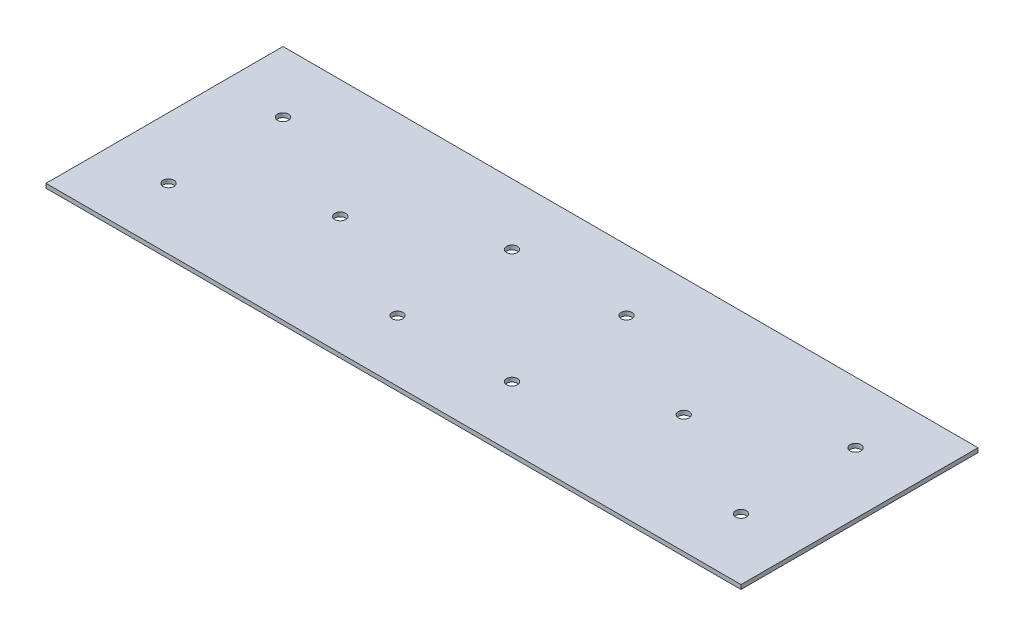
ISO-10303-21;
HEADER;
FILE_DESCRIPTION(('STEP AP214'),'2;1');
FILE_NAME('part.step','',(''),(''),'','','');
FILE_SCHEMA(('AUTOMOTIVE_DESIGN { 1 0 10303 214 1 1 1 1 }'));
ENDSEC;
DATA;
#1=APPLICATION_CONTEXT('core data for automotive mechanical design processes');
#2=APPLICATION_PROTOCOL_DEFINITION('international standard','automotive_design',2000,#1);
#3=PRODUCT_CONTEXT('',#1,'mechanical');
#4=PRODUCT('Part','Part','',(#3));
#5=PRODUCT_RELATED_PRODUCT_CATEGORY('part','',(#4));
#6=PRODUCT_DEFINITION_FORMATION('','',#4);
#7=PRODUCT_DEFINITION_CONTEXT('part definition',#1,'design');
#8=PRODUCT_DEFINITION('design','',#6,#7);
#9=PRODUCT_DEFINITION_SHAPE('','',#8);
#10=(LENGTH_UNIT() NAMED_UNIT(*) SI_UNIT(.MILLI.,.METRE.));
#11=(NAMED_UNIT(*) PLANE_ANGLE_UNIT() SI_UNIT($,.RADIAN.));
#12=(NAMED_UNIT(*) SI_UNIT($,.STERADIAN.) SOLID_ANGLE_UNIT());
#13=UNCERTAINTY_MEASURE_WITH_UNIT(LENGTH_MEASURE(1.E-05),#10,'distance_accuracy_value','');
#14=(GEOMETRIC_REPRESENTATION_CONTEXT(3) GLOBAL_UNCERTAINTY_ASSIGNED_CONTEXT((#13)) GLOBAL_UNIT_ASSIGNED_CONTEXT((#10,
#11,#12)) REPRESENTATION_CONTEXT('',''));
#15=CARTESIAN_POINT('',(0.,0.,0.));
#16=DIRECTION('',(0.,0.,1.));
#17=DIRECTION('',(1.,0.,0.));
#18=AXIS2_PLACEMENT_3D('',#15,#16,#17);
#19=CARTESIAN_POINT('',(0.,1.6,0.));
#20=DIRECTION('',(1.,0.,0.));
#21=DIRECTION('',(0.,0.,-1.));
#22=AXIS2_PLACEMENT_3D('',#19,#20,#21);
#23=PLANE('',#22);
#24=DIRECTION('',(0.,0.,1.));
#25=VECTOR('',#24,1.);
#26=CARTESIAN_POINT('',(0.,0.,0.));
#27=LINE('',#26,#25);
#28=CARTESIAN_POINT('',(0.,0.,-89.));
#29=VERTEX_POINT('',#28);
#30=CARTESIAN_POINT('',(0.,0.,0.));
#31=VERTEX_POINT('',#30);
#32=EDGE_CURVE('E97',#29,#31,#27,.T.);
#33=ORIENTED_EDGE('',*,*,#32,.T.);
#34=DIRECTION('',(0.,-1.,0.));
#35=VECTOR('',#34,1.);
#36=CARTESIAN_POINT('',(0.,1.6,0.));
#37=LINE('',#36,#35);
#38=CARTESIAN_POINT('',(0.,1.6,0.));
#39=VERTEX_POINT('',#38);
#40=EDGE_CURVE('E11',#39,#31,#37,.T.);
#41=ORIENTED_EDGE('',*,*,#40,.F.);
#42=DIRECTION('',(0.,0.,1.));
#43=VECTOR('',#42,1.);
#44=CARTESIAN_POINT('',(0.,1.6,0.));
#45=LINE('',#44,#43);
#46=CARTESIAN_POINT('',(0.,1.6,-89.));
#47=VERTEX_POINT('',#46);
#48=EDGE_CURVE('E85',#47,#39,#45,.T.);
#49=ORIENTED_EDGE('',*,*,#48,.F.);
#50=DIRECTION('',(0.,-1.,0.));
#51=VECTOR('',#50,1.);
#52=CARTESIAN_POINT('',(0.,1.6,-89.));
#53=LINE('',#52,#51);
#54=EDGE_CURVE('E93',#47,#29,#53,.T.);
#55=ORIENTED_EDGE('',*,*,#54,.T.);
#56=EDGE_LOOP('',(#33,#41,#49,#55));
#57=FACE_BOUND('',#56,.T.);
#58=ADVANCED_FACE('F34',(#57),#23,.F.);
#59=CARTESIAN_POINT('',(0.,1.6,0.));
#60=DIRECTION('',(0.,0.,-1.));
#61=DIRECTION('',(-1.,0.,0.));
#62=AXIS2_PLACEMENT_3D('',#59,#60,#61);
#63=PLANE('',#62);
#64=DIRECTION('',(1.,0.,0.));
#65=VECTOR('',#64,1.);
#66=CARTESIAN_POINT('',(0.,0.,0.));
#67=LINE('',#66,#65);
#68=CARTESIAN_POINT('',(261.,0.,0.));
#69=VERTEX_POINT('',#68);
#70=EDGE_CURVE('E89',#31,#69,#67,.T.);
#71=ORIENTED_EDGE('',*,*,#70,.T.);
#72=DIRECTION('',(0.,-1.,0.));
#73=VECTOR('',#72,1.);
#74=CARTESIAN_POINT('',(261.,1.6,0.));
#75=LINE('',#74,#73);
#76=CARTESIAN_POINT('',(261.,1.6,0.));
#77=VERTEX_POINT('',#76);
#78=EDGE_CURVE('E42',#77,#69,#75,.T.);
#79=ORIENTED_EDGE('',*,*,#78,.F.);
#80=DIRECTION('',(1.,0.,0.));
#81=VECTOR('',#80,1.);
#82=CARTESIAN_POINT('',(0.,1.6,0.));
#83=LINE('',#82,#81);
#84=EDGE_CURVE('E80',#39,#77,#83,.T.);
#85=ORIENTED_EDGE('',*,*,#84,.F.);
#86=ORIENTED_EDGE('',*,*,#40,.T.);
#87=EDGE_LOOP('',(#71,#79,#85,#86));
#88=FACE_BOUND('',#87,.T.);
#89=ADVANCED_FACE('F88',(#88),#63,.F.);
#90=CARTESIAN_POINT('',(261.,1.6,0.));
#91=DIRECTION('',(-1.,0.,0.));
#92=DIRECTION('',(0.,0.,1.));
#93=AXIS2_PLACEMENT_3D('',#90,#91,#92);
#94=PLANE('',#93);
#95=DIRECTION('',(0.,0.,-1.));
#96=VECTOR('',#95,1.);
#97=CARTESIAN_POINT('',(261.,0.,0.));
#98=LINE('',#97,#96);
#99=CARTESIAN_POINT('',(261.,0.,-89.));
#100=VERTEX_POINT('',#99);
#101=EDGE_CURVE('E67',#69,#100,#98,.T.);
#102=ORIENTED_EDGE('',*,*,#101,.T.);
#103=DIRECTION('',(0.,-1.,0.));
#104=VECTOR('',#103,1.);
#105=CARTESIAN_POINT('',(261.,1.6,-89.));
#106=LINE('',#105,#104);
#107=CARTESIAN_POINT('',(261.,1.6,-89.));
#108=VERTEX_POINT('',#107);
#109=EDGE_CURVE('E90',#108,#100,#106,.T.);
#110=ORIENTED_EDGE('',*,*,#109,.F.);
#111=DIRECTION('',(0.,0.,-1.));
#112=VECTOR('',#111,1.);
#113=CARTESIAN_POINT('',(261.,1.6,0.));
#114=LINE('',#113,#112);
#115=EDGE_CURVE('E83',#77,#108,#114,.T.);
#116=ORIENTED_EDGE('',*,*,#115,.F.);
#117=ORIENTED_EDGE('',*,*,#78,.T.);
#118=EDGE_LOOP('',(#102,#110,#116,#117));
#119=FACE_BOUND('',#118,.T.);
#120=ADVANCED_FACE('F91',(#119),#94,.F.);
#121=CARTESIAN_POINT('',(0.,1.6,-89.));
#122=DIRECTION('',(0.,0.,1.));
#123=DIRECTION('',(1.,0.,0.));
#124=AXIS2_PLACEMENT_3D('',#121,#122,#123);
#125=PLANE('',#124);
#126=DIRECTION('',(-1.,0.,0.));
#127=VECTOR('',#126,1.);
#128=CARTESIAN_POINT('',(0.,0.,-89.));
#129=LINE('',#128,#127);
#130=EDGE_CURVE('E73',#100,#29,#129,.T.);
#131=ORIENTED_EDGE('',*,*,#130,.T.);
#132=ORIENTED_EDGE('',*,*,#54,.F.);
#133=DIRECTION('',(-1.,0.,0.));
#134=VECTOR('',#133,1.);
#135=CARTESIAN_POINT('',(0.,1.6,-89.));
#136=LINE('',#135,#134);
#137=EDGE_CURVE('E50',#108,#47,#136,.T.);
#138=ORIENTED_EDGE('',*,*,#137,.F.);
#139=ORIENTED_EDGE('',*,*,#109,.T.);
#140=EDGE_LOOP('',(#131,#132,#138,#139));
#141=FACE_BOUND('',#140,.T.);
#142=ADVANCED_FACE('F105',(#141),#125,.F.);
#143=CARTESIAN_POINT('',(0.,1.6,0.));
#144=DIRECTION('',(0.,-1.,0.));
#145=DIRECTION('',(0.,0.,-1.));
#146=AXIS2_PLACEMENT_3D('',#143,#144,#145);
#147=PLANE('',#146);
#148=CARTESIAN_POINT('',(23.,1.6,-23.));
#149=DIRECTION('',(0.,1.,0.));
#150=DIRECTION('',(0.,0.,1.));
#151=AXIS2_PLACEMENT_3D('',#148,#149,#150);
#152=CIRCLE('',#151,2.05);
#153=CARTESIAN_POINT('',(23.,1.6,-20.95));
#154=VERTEX_POINT('',#153);
#155=EDGE_CURVE('E160',#154,#154,#152,.T.);
#156=ORIENTED_EDGE('',*,*,#155,.F.);
#157=EDGE_LOOP('',(#156));
#158=FACE_BOUND('',#157,.T.);
#159=CARTESIAN_POINT('',(66.,1.6,-44.5));
#160=DIRECTION('',(0.,1.,0.));
#161=DIRECTION('',(0.,0.,1.));
#162=AXIS2_PLACEMENT_3D('',#159,#160,#161);
#163=CIRCLE('',#162,2.04999999999999);
#164=CARTESIAN_POINT('',(66.,1.6,-42.45));
#165=VERTEX_POINT('',#164);
#166=EDGE_CURVE('E154',#165,#165,#163,.T.);
#167=ORIENTED_EDGE('',*,*,#166,.F.);
#168=EDGE_LOOP('',(#167));
#169=FACE_BOUND('',#168,.T.);
#170=CARTESIAN_POINT('',(109.,1.6,-66.));
#171=DIRECTION('',(0.,1.,0.));
#172=DIRECTION('',(0.,0.,1.));
#173=AXIS2_PLACEMENT_3D('',#170,#171,#172);
#174=CIRCLE('',#173,2.04999999999999);
#175=CARTESIAN_POINT('',(109.,1.6,-63.95));
#176=VERTEX_POINT('',#175);
#177=EDGE_CURVE('E148',#176,#176,#174,.T.);
#178=ORIENTED_EDGE('',*,*,#177,.F.);
#179=EDGE_LOOP('',(#178));
#180=FACE_BOUND('',#179,.T.);
#181=CARTESIAN_POINT('',(109.,1.6,-23.));
#182=DIRECTION('',(0.,1.,0.));
#183=DIRECTION('',(0.,0.,1.));
#184=AXIS2_PLACEMENT_3D('',#181,#182,#183);
#185=CIRCLE('',#184,2.04999999999999);
#186=CARTESIAN_POINT('',(109.,1.6,-20.95));
#187=VERTEX_POINT('',#186);
#188=EDGE_CURVE('E142',#187,#187,#185,.T.);
#189=ORIENTED_EDGE('',*,*,#188,.F.);
#190=EDGE_LOOP('',(#189));
#191=FACE_BOUND('',#190,.T.);
#192=CARTESIAN_POINT('',(152.,1.6,-23.));
#193=DIRECTION('',(0.,1.,0.));
#194=DIRECTION('',(0.,0.,1.));
#195=AXIS2_PLACEMENT_3D('',#192,#193,#194);
#196=CIRCLE('',#195,2.04999999999999);
#197=CARTESIAN_POINT('',(152.,1.6,-20.95));
#198=VERTEX_POINT('',#197);
#199=EDGE_CURVE('E136',#198,#198,#196,.T.);
#200=ORIENTED_EDGE('',*,*,#199,.F.);
#201=EDGE_LOOP('',(#200));
#202=FACE_BOUND('',#201,.T.);
#203=CARTESIAN_POINT('',(152.,1.6,-66.));
#204=DIRECTION('',(0.,1.,0.));
#205=DIRECTION('',(0.,0.,1.));
#206=AXIS2_PLACEMENT_3D('',#203,#204,#205);
#207=CIRCLE('',#206,2.04999999999999);
#208=CARTESIAN_POINT('',(152.,1.6,-63.95));
#209=VERTEX_POINT('',#208);
#210=EDGE_CURVE('E130',#209,#209,#207,.T.);
#211=ORIENTED_EDGE('',*,*,#210,.F.);
#212=EDGE_LOOP('',(#211));
#213=FACE_BOUND('',#212,.T.);
#214=CARTESIAN_POINT('',(195.,1.6,-44.5));
#215=DIRECTION('',(0.,1.,0.));
#216=DIRECTION('',(0.,0.,1.));
#217=AXIS2_PLACEMENT_3D('',#214,#215,#216);
#218=CIRCLE('',#217,2.04999999999999);
#219=CARTESIAN_POINT('',(195.,1.6,-42.45));
#220=VERTEX_POINT('',#219);
#221=EDGE_CURVE('E124',#220,#220,#218,.T.);
#222=ORIENTED_EDGE('',*,*,#221,.F.);
#223=EDGE_LOOP('',(#222));
#224=FACE_BOUND('',#223,.T.);
#225=CARTESIAN_POINT('',(238.,1.6,-66.));
#226=DIRECTION('',(0.,1.,0.));
#227=DIRECTION('',(0.,0.,1.));
#228=AXIS2_PLACEMENT_3D('',#225,#226,#227);
#229=CIRCLE('',#228,2.04999999999999);
#230=CARTESIAN_POINT('',(238.,1.6,-63.95));
#231=VERTEX_POINT('',#230);
#232=EDGE_CURVE('E117',#231,#231,#229,.T.);
#233=ORIENTED_EDGE('',*,*,#232,.F.);
#234=EDGE_LOOP('',(#233));
#235=FACE_BOUND('',#234,.T.);
#236=CARTESIAN_POINT('',(238.,1.6,-23.));
#237=DIRECTION('',(0.,1.,0.));
#238=DIRECTION('',(0.,0.,1.));
#239=AXIS2_PLACEMENT_3D('',#236,#237,#238);
#240=CIRCLE('',#239,2.04999999999999);
#241=CARTESIAN_POINT('',(238.,1.6,-20.95));
#242=VERTEX_POINT('',#241);
#243=EDGE_CURVE('E165',#242,#242,#240,.T.);
#244=ORIENTED_EDGE('',*,*,#243,.F.);
#245=EDGE_LOOP('',(#244));
#246=FACE_BOUND('',#245,.T.);
#247=CARTESIAN_POINT('',(23.,1.6,-66.));
#248=DIRECTION('',(0.,1.,0.));
#249=DIRECTION('',(0.,0.,1.));
#250=AXIS2_PLACEMENT_3D('',#247,#248,#249);
#251=CIRCLE('',#250,2.05);
#252=CARTESIAN_POINT('',(23.,1.6,-63.95));
#253=VERTEX_POINT('',#252);
#254=EDGE_CURVE('E111',#253,#253,#251,.T.);
#255=ORIENTED_EDGE('',*,*,#254,.F.);
#256=EDGE_LOOP('',(#255));
#257=FACE_BOUND('',#256,.T.);
#258=ORIENTED_EDGE('',*,*,#48,.T.);
#259=ORIENTED_EDGE('',*,*,#84,.T.);
#260=ORIENTED_EDGE('',*,*,#115,.T.);
#261=ORIENTED_EDGE('',*,*,#137,.T.);
#262=EDGE_LOOP('',(#258,#259,#260,#261));
#263=FACE_BOUND('',#262,.T.);
#264=ADVANCED_FACE('F81',(#158,#169,#180,#191,#202,#213,#224,#235,#246,#257,#263),#147,.F.);
#265=CARTESIAN_POINT('',(0.,0.,0.));
#266=DIRECTION('',(0.,-1.,0.));
#267=DIRECTION('',(0.,0.,-1.));
#268=AXIS2_PLACEMENT_3D('',#265,#266,#267);
#269=PLANE('',#268);
#270=CARTESIAN_POINT('',(23.,0.,-23.));
#271=DIRECTION('',(0.,1.,0.));
#272=DIRECTION('',(0.,0.,1.));
#273=AXIS2_PLACEMENT_3D('',#270,#271,#272);
#274=CIRCLE('',#273,2.05);
#275=CARTESIAN_POINT('',(23.,0.,-20.95));
#276=VERTEX_POINT('',#275);
#277=EDGE_CURVE('E114',#276,#276,#274,.T.);
#278=ORIENTED_EDGE('',*,*,#277,.T.);
#279=EDGE_LOOP('',(#278));
#280=FACE_BOUND('',#279,.T.);
#281=CARTESIAN_POINT('',(66.,0.,-44.5));
#282=DIRECTION('',(0.,1.,0.));
#283=DIRECTION('',(0.,0.,1.));
#284=AXIS2_PLACEMENT_3D('',#281,#282,#283);
#285=CIRCLE('',#284,2.04999999999999);
#286=CARTESIAN_POINT('',(66.,0.,-42.45));
#287=VERTEX_POINT('',#286);
#288=EDGE_CURVE('E157',#287,#287,#285,.T.);
#289=ORIENTED_EDGE('',*,*,#288,.T.);
#290=EDGE_LOOP('',(#289));
#291=FACE_BOUND('',#290,.T.);
#292=CARTESIAN_POINT('',(109.,0.,-66.));
#293=DIRECTION('',(0.,1.,0.));
#294=DIRECTION('',(0.,0.,1.));
#295=AXIS2_PLACEMENT_3D('',#292,#293,#294);
#296=CIRCLE('',#295,2.04999999999999);
#297=CARTESIAN_POINT('',(109.,0.,-63.95));
#298=VERTEX_POINT('',#297);
#299=EDGE_CURVE('E151',#298,#298,#296,.T.);
#300=ORIENTED_EDGE('',*,*,#299,.T.);
#301=EDGE_LOOP('',(#300));
#302=FACE_BOUND('',#301,.T.);
#303=CARTESIAN_POINT('',(109.,0.,-23.));
#304=DIRECTION('',(0.,1.,0.));
#305=DIRECTION('',(0.,0.,1.));
#306=AXIS2_PLACEMENT_3D('',#303,#304,#305);
#307=CIRCLE('',#306,2.04999999999999);
#308=CARTESIAN_POINT('',(109.,0.,-20.95));
#309=VERTEX_POINT('',#308);
#310=EDGE_CURVE('E145',#309,#309,#307,.T.);
#311=ORIENTED_EDGE('',*,*,#310,.T.);
#312=EDGE_LOOP('',(#311));
#313=FACE_BOUND('',#312,.T.);
#314=CARTESIAN_POINT('',(152.,0.,-23.));
#315=DIRECTION('',(0.,1.,0.));
#316=DIRECTION('',(0.,0.,1.));
#317=AXIS2_PLACEMENT_3D('',#314,#315,#316);
#318=CIRCLE('',#317,2.04999999999999);
#319=CARTESIAN_POINT('',(152.,0.,-20.95));
#320=VERTEX_POINT('',#319);
#321=EDGE_CURVE('E139',#320,#320,#318,.T.);
#322=ORIENTED_EDGE('',*,*,#321,.T.);
#323=EDGE_LOOP('',(#322));
#324=FACE_BOUND('',#323,.T.);
#325=CARTESIAN_POINT('',(152.,0.,-66.));
#326=DIRECTION('',(0.,1.,0.));
#327=DIRECTION('',(0.,0.,1.));
#328=AXIS2_PLACEMENT_3D('',#325,#326,#327);
#329=CIRCLE('',#328,2.04999999999999);
#330=CARTESIAN_POINT('',(152.,0.,-63.95));
#331=VERTEX_POINT('',#330);
#332=EDGE_CURVE('E133',#331,#331,#329,.T.);
#333=ORIENTED_EDGE('',*,*,#332,.T.);
#334=EDGE_LOOP('',(#333));
#335=FACE_BOUND('',#334,.T.);
#336=CARTESIAN_POINT('',(195.,0.,-44.5));
#337=DIRECTION('',(0.,1.,0.));
#338=DIRECTION('',(0.,0.,1.));
#339=AXIS2_PLACEMENT_3D('',#336,#337,#338);
#340=CIRCLE('',#339,2.04999999999999);
#341=CARTESIAN_POINT('',(195.,0.,-42.45));
#342=VERTEX_POINT('',#341);
#343=EDGE_CURVE('E127',#342,#342,#340,.T.);
#344=ORIENTED_EDGE('',*,*,#343,.T.);
#345=EDGE_LOOP('',(#344));
#346=FACE_BOUND('',#345,.T.);
#347=CARTESIAN_POINT('',(238.,0.,-66.));
#348=DIRECTION('',(0.,1.,0.));
#349=DIRECTION('',(0.,0.,1.));
#350=AXIS2_PLACEMENT_3D('',#347,#348,#349);
#351=CIRCLE('',#350,2.04999999999999);
#352=CARTESIAN_POINT('',(238.,0.,-63.95));
#353=VERTEX_POINT('',#352);
#354=EDGE_CURVE('E120',#353,#353,#351,.T.);
#355=ORIENTED_EDGE('',*,*,#354,.T.);
#356=EDGE_LOOP('',(#355));
#357=FACE_BOUND('',#356,.T.);
#358=CARTESIAN_POINT('',(238.,0.,-23.));
#359=DIRECTION('',(0.,1.,0.));
#360=DIRECTION('',(0.,0.,1.));
#361=AXIS2_PLACEMENT_3D('',#358,#359,#360);
#362=CIRCLE('',#361,2.04999999999999);
#363=CARTESIAN_POINT('',(238.,0.,-20.95));
#364=VERTEX_POINT('',#363);
#365=EDGE_CURVE('E121',#364,#364,#362,.T.);
#366=ORIENTED_EDGE('',*,*,#365,.T.);
#367=EDGE_LOOP('',(#366));
#368=FACE_BOUND('',#367,.T.);
#369=CARTESIAN_POINT('',(23.,0.,-66.));
#370=DIRECTION('',(0.,1.,0.));
#371=DIRECTION('',(0.,0.,1.));
#372=AXIS2_PLACEMENT_3D('',#369,#370,#371);
#373=CIRCLE('',#372,2.05);
#374=CARTESIAN_POINT('',(23.,0.,-63.95));
#375=VERTEX_POINT('',#374);
#376=EDGE_CURVE('E100',#375,#375,#373,.T.);
#377=ORIENTED_EDGE('',*,*,#376,.T.);
#378=EDGE_LOOP('',(#377));
#379=FACE_BOUND('',#378,.T.);
#380=ORIENTED_EDGE('',*,*,#32,.F.);
#381=ORIENTED_EDGE('',*,*,#130,.F.);
#382=ORIENTED_EDGE('',*,*,#101,.F.);
#383=ORIENTED_EDGE('',*,*,#70,.F.);
#384=EDGE_LOOP('',(#380,#381,#382,#383));
#385=FACE_BOUND('',#384,.T.);
#386=ADVANCED_FACE('F108',(#280,#291,#302,#313,#324,#335,#346,#357,#368,#379,#385),#269,.T.);
#387=CARTESIAN_POINT('',(23.,0.,-66.));
#388=DIRECTION('',(0.,1.,0.));
#389=DIRECTION('',(0.,0.,1.));
#390=AXIS2_PLACEMENT_3D('',#387,#388,#389);
#391=CYLINDRICAL_SURFACE('',#390,2.05);
#392=ORIENTED_EDGE('',*,*,#376,.F.);
#393=EDGE_LOOP('',(#392));
#394=FACE_BOUND('',#393,.T.);
#395=ORIENTED_EDGE('',*,*,#254,.T.);
#396=EDGE_LOOP('',(#395));
#397=FACE_BOUND('',#396,.T.);
#398=ADVANCED_FACE('F177',(#394,#397),#391,.F.);
#399=CARTESIAN_POINT('',(238.,0.,-23.));
#400=DIRECTION('',(0.,1.,0.));
#401=DIRECTION('',(0.,0.,1.));
#402=AXIS2_PLACEMENT_3D('',#399,#400,#401);
#403=CYLINDRICAL_SURFACE('',#402,2.04999999999999);
#404=ORIENTED_EDGE('',*,*,#365,.F.);
#405=EDGE_LOOP('',(#404));
#406=FACE_BOUND('',#405,.T.);
#407=ORIENTED_EDGE('',*,*,#243,.T.);
#408=EDGE_LOOP('',(#407));
#409=FACE_BOUND('',#408,.T.);
#410=ADVANCED_FACE('F173',(#406,#409),#403,.F.);
#411=CARTESIAN_POINT('',(238.,0.,-66.));
#412=DIRECTION('',(0.,1.,0.));
#413=DIRECTION('',(0.,0.,1.));
#414=AXIS2_PLACEMENT_3D('',#411,#412,#413);
#415=CYLINDRICAL_SURFACE('',#414,2.04999999999999);
#416=ORIENTED_EDGE('',*,*,#354,.F.);
#417=EDGE_LOOP('',(#416));
#418=FACE_BOUND('',#417,.T.);
#419=ORIENTED_EDGE('',*,*,#232,.T.);
#420=EDGE_LOOP('',(#419));
#421=FACE_BOUND('',#420,.T.);
#422=ADVANCED_FACE('F176',(#418,#421),#415,.F.);
#423=CARTESIAN_POINT('',(195.,0.,-44.5));
#424=DIRECTION('',(0.,1.,0.));
#425=DIRECTION('',(0.,0.,1.));
#426=AXIS2_PLACEMENT_3D('',#423,#424,#425);
#427=CYLINDRICAL_SURFACE('',#426,2.04999999999999);
#428=ORIENTED_EDGE('',*,*,#343,.F.);
#429=EDGE_LOOP('',(#428));
#430=FACE_BOUND('',#429,.T.);
#431=ORIENTED_EDGE('',*,*,#221,.T.);
#432=EDGE_LOOP('',(#431));
#433=FACE_BOUND('',#432,.T.);
#434=ADVANCED_FACE('F238',(#430,#433),#427,.F.);
#435=CARTESIAN_POINT('',(152.,0.,-66.));
#436=DIRECTION('',(0.,1.,0.));
#437=DIRECTION('',(0.,0.,1.));
#438=AXIS2_PLACEMENT_3D('',#435,#436,#437);
#439=CYLINDRICAL_SURFACE('',#438,2.04999999999999);
#440=ORIENTED_EDGE('',*,*,#332,.F.);
#441=EDGE_LOOP('',(#440));
#442=FACE_BOUND('',#441,.T.);
#443=ORIENTED_EDGE('',*,*,#210,.T.);
#444=EDGE_LOOP('',(#443));
#445=FACE_BOUND('',#444,.T.);
#446=ADVANCED_FACE('F247',(#442,#445),#439,.F.);
#447=CARTESIAN_POINT('',(152.,0.,-23.));
#448=DIRECTION('',(0.,1.,0.));
#449=DIRECTION('',(0.,0.,1.));
#450=AXIS2_PLACEMENT_3D('',#447,#448,#449);
#451=CYLINDRICAL_SURFACE('',#450,2.04999999999999);
#452=ORIENTED_EDGE('',*,*,#321,.F.);
#453=EDGE_LOOP('',(#452));
#454=FACE_BOUND('',#453,.T.);
#455=ORIENTED_EDGE('',*,*,#199,.T.);
#456=EDGE_LOOP('',(#455));
#457=FACE_BOUND('',#456,.T.);
#458=ADVANCED_FACE('F257',(#454,#457),#451,.F.);
#459=CARTESIAN_POINT('',(109.,0.,-23.));
#460=DIRECTION('',(0.,1.,0.));
#461=DIRECTION('',(0.,0.,1.));
#462=AXIS2_PLACEMENT_3D('',#459,#460,#461);
#463=CYLINDRICAL_SURFACE('',#462,2.04999999999999);
#464=ORIENTED_EDGE('',*,*,#310,.F.);
#465=EDGE_LOOP('',(#464));
#466=FACE_BOUND('',#465,.T.);
#467=ORIENTED_EDGE('',*,*,#188,.T.);
#468=EDGE_LOOP('',(#467));
#469=FACE_BOUND('',#468,.T.);
#470=ADVANCED_FACE('F267',(#466,#469),#463,.F.);
#471=CARTESIAN_POINT('',(109.,0.,-66.));
#472=DIRECTION('',(0.,1.,0.));
#473=DIRECTION('',(0.,0.,1.));
#474=AXIS2_PLACEMENT_3D('',#471,#472,#473);
#475=CYLINDRICAL_SURFACE('',#474,2.04999999999999);
#476=ORIENTED_EDGE('',*,*,#299,.F.);
#477=EDGE_LOOP('',(#476));
#478=FACE_BOUND('',#477,.T.);
#479=ORIENTED_EDGE('',*,*,#177,.T.);
#480=EDGE_LOOP('',(#479));
#481=FACE_BOUND('',#480,.T.);
#482=ADVANCED_FACE('F277',(#478,#481),#475,.F.);
#483=CARTESIAN_POINT('',(66.,0.,-44.5));
#484=DIRECTION('',(0.,1.,0.));
#485=DIRECTION('',(0.,0.,1.));
#486=AXIS2_PLACEMENT_3D('',#483,#484,#485);
#487=CYLINDRICAL_SURFACE('',#486,2.04999999999999);
#488=ORIENTED_EDGE('',*,*,#288,.F.);
#489=EDGE_LOOP('',(#488));
#490=FACE_BOUND('',#489,.T.);
#491=ORIENTED_EDGE('',*,*,#166,.T.);
#492=EDGE_LOOP('',(#491));
#493=FACE_BOUND('',#492,.T.);
#494=ADVANCED_FACE('F287',(#490,#493),#487,.F.);
#495=CARTESIAN_POINT('',(23.,0.,-23.));
#496=DIRECTION('',(0.,1.,0.));
#497=DIRECTION('',(0.,0.,1.));
#498=AXIS2_PLACEMENT_3D('',#495,#496,#497);
#499=CYLINDRICAL_SURFACE('',#498,2.05);
#500=ORIENTED_EDGE('',*,*,#277,.F.);
#501=EDGE_LOOP('',(#500));
#502=FACE_BOUND('',#501,.T.);
#503=ORIENTED_EDGE('',*,*,#155,.T.);
#504=EDGE_LOOP('',(#503));
#505=FACE_BOUND('',#504,.T.);
#506=ADVANCED_FACE('F297',(#502,#505),#499,.F.);
#507=CLOSED_SHELL('',(#58,#89,#120,#142,#264,#386,#398,#410,#422,#434,#446,#458,#470,#482,#494,#506));
#508=MANIFOLD_SOLID_BREP('B2',#507);
#509=ADVANCED_BREP_SHAPE_REPRESENTATION('',(#18,#508),#14);
#510=SHAPE_DEFINITION_REPRESENTATION(#9,#509);
ENDSEC;
END-ISO-10303-21;
